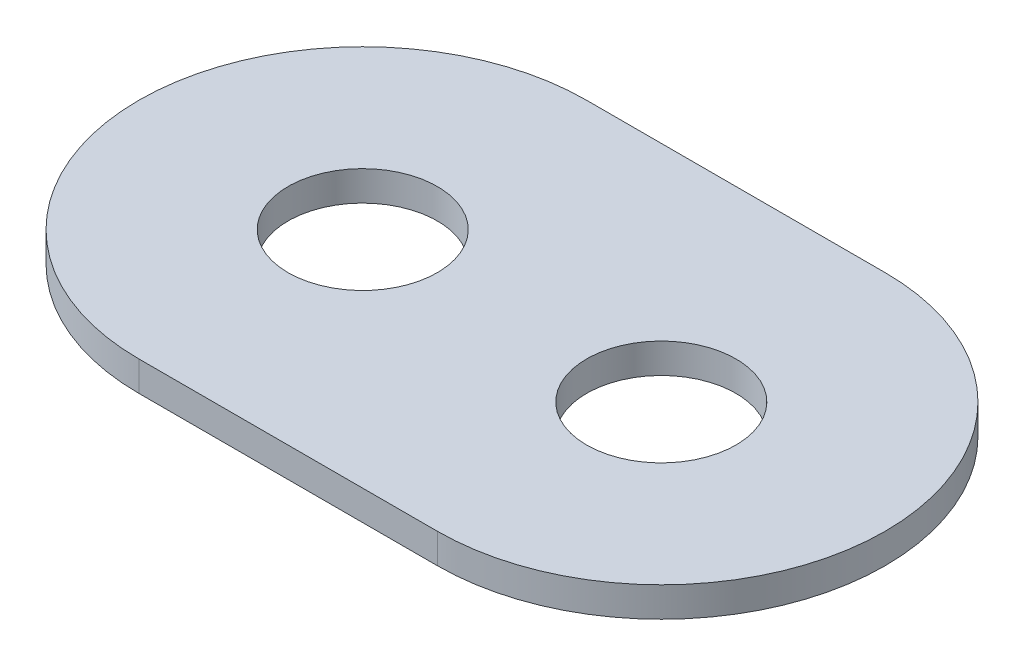
ISO-10303-21;
HEADER;
FILE_DESCRIPTION(('STEP AP214'),'2;1');
FILE_NAME('part.step','',(''),(''),'','','');
FILE_SCHEMA(('AUTOMOTIVE_DESIGN { 1 0 10303 214 1 1 1 1 }'));
ENDSEC;
DATA;
#1=APPLICATION_CONTEXT('core data for automotive mechanical design processes');
#2=APPLICATION_PROTOCOL_DEFINITION('international standard','automotive_design',2000,#1);
#3=PRODUCT_CONTEXT('',#1,'mechanical');
#4=PRODUCT('Part','Part','',(#3));
#5=PRODUCT_RELATED_PRODUCT_CATEGORY('part','',(#4));
#6=PRODUCT_DEFINITION_FORMATION('','',#4);
#7=PRODUCT_DEFINITION_CONTEXT('part definition',#1,'design');
#8=PRODUCT_DEFINITION('design','',#6,#7);
#9=PRODUCT_DEFINITION_SHAPE('','',#8);
#10=(LENGTH_UNIT() NAMED_UNIT(*) SI_UNIT(.MILLI.,.METRE.));
#11=(NAMED_UNIT(*) PLANE_ANGLE_UNIT() SI_UNIT($,.RADIAN.));
#12=(NAMED_UNIT(*) SI_UNIT($,.STERADIAN.) SOLID_ANGLE_UNIT());
#13=UNCERTAINTY_MEASURE_WITH_UNIT(LENGTH_MEASURE(1.E-05),#10,'distance_accuracy_value','');
#14=(GEOMETRIC_REPRESENTATION_CONTEXT(3) GLOBAL_UNCERTAINTY_ASSIGNED_CONTEXT((#13)) GLOBAL_UNIT_ASSIGNED_CONTEXT((#10,
#11,#12)) REPRESENTATION_CONTEXT('',''));
#15=CARTESIAN_POINT('',(0.,0.,0.));
#16=DIRECTION('',(0.,0.,1.));
#17=DIRECTION('',(1.,0.,0.));
#18=AXIS2_PLACEMENT_3D('',#15,#16,#17);
#19=CARTESIAN_POINT('',(0.,2.,15.));
#20=DIRECTION('',(0.,0.,-1.));
#21=DIRECTION('',(-1.,0.,0.));
#22=AXIS2_PLACEMENT_3D('',#19,#20,#21);
#23=PLANE('',#22);
#24=DIRECTION('',(1.,0.,0.));
#25=VECTOR('',#24,1.);
#26=CARTESIAN_POINT('',(0.,0.,15.));
#27=LINE('',#26,#25);
#28=CARTESIAN_POINT('',(-10.,0.,15.));
#29=VERTEX_POINT('',#28);
#30=CARTESIAN_POINT('',(10.,0.,15.));
#31=VERTEX_POINT('',#30);
#32=EDGE_CURVE('E115',#29,#31,#27,.T.);
#33=ORIENTED_EDGE('',*,*,#32,.T.);
#34=DIRECTION('',(0.,-1.,0.));
#35=VECTOR('',#34,1.);
#36=CARTESIAN_POINT('',(10.,2.,15.));
#37=LINE('',#36,#35);
#38=CARTESIAN_POINT('',(10.,2.,15.));
#39=VERTEX_POINT('',#38);
#40=EDGE_CURVE('E11',#39,#31,#37,.T.);
#41=ORIENTED_EDGE('',*,*,#40,.F.);
#42=DIRECTION('',(1.,0.,0.));
#43=VECTOR('',#42,1.);
#44=CARTESIAN_POINT('',(0.,2.,15.));
#45=LINE('',#44,#43);
#46=CARTESIAN_POINT('',(-10.,2.,15.));
#47=VERTEX_POINT('',#46);
#48=EDGE_CURVE('E88',#47,#39,#45,.T.);
#49=ORIENTED_EDGE('',*,*,#48,.F.);
#50=DIRECTION('',(0.,-1.,0.));
#51=VECTOR('',#50,1.);
#52=CARTESIAN_POINT('',(-10.,2.,15.));
#53=LINE('',#52,#51);
#54=EDGE_CURVE('E103',#47,#29,#53,.T.);
#55=ORIENTED_EDGE('',*,*,#54,.T.);
#56=EDGE_LOOP('',(#33,#41,#49,#55));
#57=FACE_BOUND('',#56,.T.);
#58=ADVANCED_FACE('F39',(#57),#23,.F.);
#59=CARTESIAN_POINT('',(10.,2.,0.));
#60=DIRECTION('',(0.,-1.,0.));
#61=DIRECTION('',(0.,0.,-1.));
#62=AXIS2_PLACEMENT_3D('',#59,#60,#61);
#63=CYLINDRICAL_SURFACE('',#62,15.);
#64=CARTESIAN_POINT('',(10.,0.,0.));
#65=DIRECTION('',(0.,1.,0.));
#66=DIRECTION('',(0.,0.,1.));
#67=AXIS2_PLACEMENT_3D('',#64,#65,#66);
#68=CIRCLE('',#67,15.);
#69=CARTESIAN_POINT('',(9.99999999999999,0.,-15.));
#70=VERTEX_POINT('',#69);
#71=EDGE_CURVE('E94',#31,#70,#68,.T.);
#72=ORIENTED_EDGE('',*,*,#71,.T.);
#73=DIRECTION('',(0.,-1.,0.));
#74=VECTOR('',#73,1.);
#75=CARTESIAN_POINT('',(9.99999999999999,2.,-15.));
#76=LINE('',#75,#74);
#77=CARTESIAN_POINT('',(9.99999999999999,2.,-15.));
#78=VERTEX_POINT('',#77);
#79=EDGE_CURVE('E49',#78,#70,#76,.T.);
#80=ORIENTED_EDGE('',*,*,#79,.F.);
#81=CARTESIAN_POINT('',(10.,2.,0.));
#82=DIRECTION('',(0.,1.,0.));
#83=DIRECTION('',(0.,0.,1.));
#84=AXIS2_PLACEMENT_3D('',#81,#82,#83);
#85=CIRCLE('',#84,15.);
#86=EDGE_CURVE('E83',#39,#78,#85,.T.);
#87=ORIENTED_EDGE('',*,*,#86,.F.);
#88=ORIENTED_EDGE('',*,*,#40,.T.);
#89=EDGE_LOOP('',(#72,#80,#87,#88));
#90=FACE_BOUND('',#89,.T.);
#91=ADVANCED_FACE('F93',(#90),#63,.T.);
#92=CARTESIAN_POINT('',(0.,2.,-15.));
#93=DIRECTION('',(0.,0.,-1.));
#94=DIRECTION('',(-1.,0.,0.));
#95=AXIS2_PLACEMENT_3D('',#92,#93,#94);
#96=PLANE('',#95);
#97=DIRECTION('',(1.,0.,0.));
#98=VECTOR('',#97,1.);
#99=CARTESIAN_POINT('',(0.,0.,-15.));
#100=LINE('',#99,#98);
#101=CARTESIAN_POINT('',(-10.,0.,-15.));
#102=VERTEX_POINT('',#101);
#103=EDGE_CURVE('E121',#102,#70,#100,.T.);
#104=ORIENTED_EDGE('',*,*,#103,.F.);
#105=DIRECTION('',(0.,-1.,0.));
#106=VECTOR('',#105,1.);
#107=CARTESIAN_POINT('',(-10.,2.,-15.));
#108=LINE('',#107,#106);
#109=CARTESIAN_POINT('',(-10.,2.,-15.));
#110=VERTEX_POINT('',#109);
#111=EDGE_CURVE('E73',#110,#102,#108,.T.);
#112=ORIENTED_EDGE('',*,*,#111,.F.);
#113=DIRECTION('',(1.,0.,0.));
#114=VECTOR('',#113,1.);
#115=CARTESIAN_POINT('',(0.,2.,-15.));
#116=LINE('',#115,#114);
#117=EDGE_CURVE('E86',#110,#78,#116,.T.);
#118=ORIENTED_EDGE('',*,*,#117,.T.);
#119=ORIENTED_EDGE('',*,*,#79,.T.);
#120=EDGE_LOOP('',(#104,#112,#118,#119));
#121=FACE_BOUND('',#120,.T.);
#122=ADVANCED_FACE('F99',(#121),#96,.T.);
#123=CARTESIAN_POINT('',(-10.,2.,0.));
#124=DIRECTION('',(0.,-1.,0.));
#125=DIRECTION('',(0.,0.,-1.));
#126=AXIS2_PLACEMENT_3D('',#123,#124,#125);
#127=CYLINDRICAL_SURFACE('',#126,5.);
#128=CARTESIAN_POINT('',(-10.,2.,0.));
#129=DIRECTION('',(0.,1.,0.));
#130=DIRECTION('',(0.,0.,1.));
#131=AXIS2_PLACEMENT_3D('',#128,#129,#130);
#132=CIRCLE('',#131,5.);
#133=CARTESIAN_POINT('',(-10.,2.,5.));
#134=VERTEX_POINT('',#133);
#135=EDGE_CURVE('E163',#134,#134,#132,.T.);
#136=ORIENTED_EDGE('',*,*,#135,.T.);
#137=EDGE_LOOP('',(#136));
#138=FACE_BOUND('',#137,.T.);
#139=CARTESIAN_POINT('',(-10.,0.,0.));
#140=DIRECTION('',(0.,1.,0.));
#141=DIRECTION('',(0.,0.,1.));
#142=AXIS2_PLACEMENT_3D('',#139,#140,#141);
#143=CIRCLE('',#142,5.);
#144=CARTESIAN_POINT('',(-10.,0.,5.));
#145=VERTEX_POINT('',#144);
#146=EDGE_CURVE('E111',#145,#145,#143,.T.);
#147=ORIENTED_EDGE('',*,*,#146,.F.);
#148=EDGE_LOOP('',(#147));
#149=FACE_BOUND('',#148,.T.);
#150=ADVANCED_FACE('F152',(#138,#149),#127,.F.);
#151=CARTESIAN_POINT('',(10.,2.,0.));
#152=DIRECTION('',(0.,-1.,0.));
#153=DIRECTION('',(0.,0.,-1.));
#154=AXIS2_PLACEMENT_3D('',#151,#152,#153);
#155=CYLINDRICAL_SURFACE('',#154,5.);
#156=CARTESIAN_POINT('',(10.,2.,0.));
#157=DIRECTION('',(0.,1.,0.));
#158=DIRECTION('',(0.,0.,1.));
#159=AXIS2_PLACEMENT_3D('',#156,#157,#158);
#160=CIRCLE('',#159,5.);
#161=CARTESIAN_POINT('',(10.,2.,4.99999999999999));
#162=VERTEX_POINT('',#161);
#163=EDGE_CURVE('E126',#162,#162,#160,.T.);
#164=ORIENTED_EDGE('',*,*,#163,.T.);
#165=EDGE_LOOP('',(#164));
#166=FACE_BOUND('',#165,.T.);
#167=CARTESIAN_POINT('',(10.,0.,0.));
#168=DIRECTION('',(0.,1.,0.));
#169=DIRECTION('',(0.,0.,1.));
#170=AXIS2_PLACEMENT_3D('',#167,#168,#169);
#171=CIRCLE('',#170,5.);
#172=CARTESIAN_POINT('',(10.,0.,4.99999999999999));
#173=VERTEX_POINT('',#172);
#174=EDGE_CURVE('E107',#173,#173,#171,.T.);
#175=ORIENTED_EDGE('',*,*,#174,.F.);
#176=EDGE_LOOP('',(#175));
#177=FACE_BOUND('',#176,.T.);
#178=ADVANCED_FACE('F41',(#166,#177),#155,.F.);
#179=CARTESIAN_POINT('',(-10.,2.,0.));
#180=DIRECTION('',(0.,-1.,0.));
#181=DIRECTION('',(0.,0.,-1.));
#182=AXIS2_PLACEMENT_3D('',#179,#180,#181);
#183=CYLINDRICAL_SURFACE('',#182,15.);
#184=CARTESIAN_POINT('',(-10.,0.,0.));
#185=DIRECTION('',(0.,1.,0.));
#186=DIRECTION('',(0.,0.,1.));
#187=AXIS2_PLACEMENT_3D('',#184,#185,#186);
#188=CIRCLE('',#187,15.);
#189=EDGE_CURVE('E76',#102,#29,#188,.T.);
#190=ORIENTED_EDGE('',*,*,#189,.T.);
#191=ORIENTED_EDGE('',*,*,#54,.F.);
#192=CARTESIAN_POINT('',(-10.,2.,0.));
#193=DIRECTION('',(0.,1.,0.));
#194=DIRECTION('',(0.,0.,1.));
#195=AXIS2_PLACEMENT_3D('',#192,#193,#194);
#196=CIRCLE('',#195,15.);
#197=EDGE_CURVE('E57',#110,#47,#196,.T.);
#198=ORIENTED_EDGE('',*,*,#197,.F.);
#199=ORIENTED_EDGE('',*,*,#111,.T.);
#200=EDGE_LOOP('',(#190,#191,#198,#199));
#201=FACE_BOUND('',#200,.T.);
#202=ADVANCED_FACE('F140',(#201),#183,.T.);
#203=CARTESIAN_POINT('',(0.,2.,0.));
#204=DIRECTION('',(0.,1.,0.));
#205=DIRECTION('',(0.,0.,1.));
#206=AXIS2_PLACEMENT_3D('',#203,#204,#205);
#207=PLANE('',#206);
#208=ORIENTED_EDGE('',*,*,#163,.F.);
#209=EDGE_LOOP('',(#208));
#210=FACE_BOUND('',#209,.T.);
#211=ORIENTED_EDGE('',*,*,#135,.F.);
#212=EDGE_LOOP('',(#211));
#213=FACE_BOUND('',#212,.T.);
#214=ORIENTED_EDGE('',*,*,#48,.T.);
#215=ORIENTED_EDGE('',*,*,#86,.T.);
#216=ORIENTED_EDGE('',*,*,#117,.F.);
#217=ORIENTED_EDGE('',*,*,#197,.T.);
#218=EDGE_LOOP('',(#214,#215,#216,#217));
#219=FACE_BOUND('',#218,.T.);
#220=ADVANCED_FACE('F84',(#210,#213,#219),#207,.T.);
#221=CARTESIAN_POINT('',(0.,0.,0.));
#222=DIRECTION('',(0.,1.,0.));
#223=DIRECTION('',(0.,0.,1.));
#224=AXIS2_PLACEMENT_3D('',#221,#222,#223);
#225=PLANE('',#224);
#226=ORIENTED_EDGE('',*,*,#174,.T.);
#227=EDGE_LOOP('',(#226));
#228=FACE_BOUND('',#227,.T.);
#229=ORIENTED_EDGE('',*,*,#146,.T.);
#230=EDGE_LOOP('',(#229));
#231=FACE_BOUND('',#230,.T.);
#232=ORIENTED_EDGE('',*,*,#32,.F.);
#233=ORIENTED_EDGE('',*,*,#189,.F.);
#234=ORIENTED_EDGE('',*,*,#103,.T.);
#235=ORIENTED_EDGE('',*,*,#71,.F.);
#236=EDGE_LOOP('',(#232,#233,#234,#235));
#237=FACE_BOUND('',#236,.T.);
#238=ADVANCED_FACE('F133',(#228,#231,#237),#225,.F.);
#239=CLOSED_SHELL('',(#58,#91,#122,#150,#178,#202,#220,#238));
#240=MANIFOLD_SOLID_BREP('B2',#239);
#241=ADVANCED_BREP_SHAPE_REPRESENTATION('',(#18,#240),#14);
#242=SHAPE_DEFINITION_REPRESENTATION(#9,#241);
ENDSEC;
END-ISO-10303-21;
